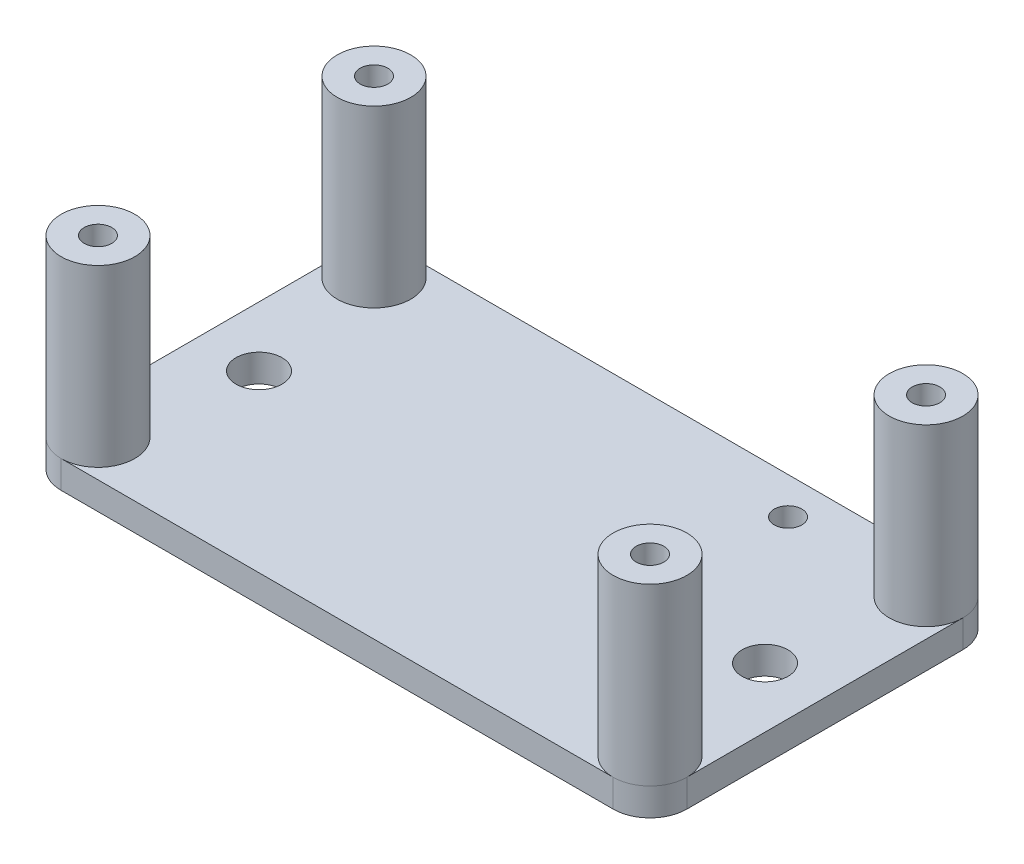
ISO-10303-21;
HEADER;
FILE_DESCRIPTION(('STEP AP214'),'2;1');
FILE_NAME('part.step','',(''),(''),'','','');
FILE_SCHEMA(('AUTOMOTIVE_DESIGN { 1 0 10303 214 1 1 1 1 }'));
ENDSEC;
DATA;
#1=APPLICATION_CONTEXT('core data for automotive mechanical design processes');
#2=APPLICATION_PROTOCOL_DEFINITION('international standard','automotive_design',2000,#1);
#3=PRODUCT_CONTEXT('',#1,'mechanical');
#4=PRODUCT('Part','Part','',(#3));
#5=PRODUCT_RELATED_PRODUCT_CATEGORY('part','',(#4));
#6=PRODUCT_DEFINITION_FORMATION('','',#4);
#7=PRODUCT_DEFINITION_CONTEXT('part definition',#1,'design');
#8=PRODUCT_DEFINITION('design','',#6,#7);
#9=PRODUCT_DEFINITION_SHAPE('','',#8);
#10=(LENGTH_UNIT() NAMED_UNIT(*) SI_UNIT(.MILLI.,.METRE.));
#11=(NAMED_UNIT(*) PLANE_ANGLE_UNIT() SI_UNIT($,.RADIAN.));
#12=(NAMED_UNIT(*) SI_UNIT($,.STERADIAN.) SOLID_ANGLE_UNIT());
#13=UNCERTAINTY_MEASURE_WITH_UNIT(LENGTH_MEASURE(1.E-05),#10,'distance_accuracy_value','');
#14=(GEOMETRIC_REPRESENTATION_CONTEXT(3) GLOBAL_UNCERTAINTY_ASSIGNED_CONTEXT((#13)) GLOBAL_UNIT_ASSIGNED_CONTEXT((#10,
#11,#12)) REPRESENTATION_CONTEXT('',''));
#15=CARTESIAN_POINT('',(0.,0.,0.));
#16=DIRECTION('',(0.,0.,1.));
#17=DIRECTION('',(1.,0.,0.));
#18=AXIS2_PLACEMENT_3D('',#15,#16,#17);
#19=CARTESIAN_POINT('',(0.,3.,0.));
#20=DIRECTION('',(0.,-1.,0.));
#21=DIRECTION('',(0.,0.,-1.));
#22=AXIS2_PLACEMENT_3D('',#19,#20,#21);
#23=PLANE('',#22);
#24=CARTESIAN_POINT('',(25.,3.,-14.1346153846153));
#25=DIRECTION('',(0.,1.,0.));
#26=DIRECTION('',(0.,0.,1.));
#27=AXIS2_PLACEMENT_3D('',#24,#25,#26);
#28=CIRCLE('',#27,1.5);
#29=CARTESIAN_POINT('',(25.,3.,-12.6346153846153));
#30=VERTEX_POINT('',#29);
#31=EDGE_CURVE('E191',#30,#30,#28,.T.);
#32=ORIENTED_EDGE('',*,*,#31,.F.);
#33=EDGE_LOOP('',(#32));
#34=FACE_BOUND('',#33,.T.);
#35=CARTESIAN_POINT('',(37.5,3.,0.865384615384675));
#36=DIRECTION('',(0.,1.,0.));
#37=DIRECTION('',(0.,0.,-1.));
#38=AXIS2_PLACEMENT_3D('',#35,#36,#37);
#39=CIRCLE('',#38,2.5);
#40=CARTESIAN_POINT('',(37.5,3.,-1.63461538461533));
#41=VERTEX_POINT('',#40);
#42=EDGE_CURVE('E185',#41,#41,#39,.T.);
#43=ORIENTED_EDGE('',*,*,#42,.F.);
#44=EDGE_LOOP('',(#43));
#45=FACE_BOUND('',#44,.T.);
#46=CARTESIAN_POINT('',(-17.5,3.,0.865384615384682));
#47=DIRECTION('',(0.,1.,0.));
#48=DIRECTION('',(0.,0.,1.));
#49=AXIS2_PLACEMENT_3D('',#46,#47,#48);
#50=CIRCLE('',#49,2.5);
#51=CARTESIAN_POINT('',(-17.5,3.,3.36538461538468));
#52=VERTEX_POINT('',#51);
#53=EDGE_CURVE('E181',#52,#52,#50,.T.);
#54=ORIENTED_EDGE('',*,*,#53,.F.);
#55=EDGE_LOOP('',(#54));
#56=FACE_BOUND('',#55,.T.);
#57=CARTESIAN_POINT('',(40.,3.,-14.1346153846153));
#58=DIRECTION('',(0.,1.,0.));
#59=DIRECTION('',(0.,0.,1.));
#60=AXIS2_PLACEMENT_3D('',#57,#58,#59);
#61=CIRCLE('',#60,4.);
#62=CARTESIAN_POINT('',(40.,3.,-18.1346153846153));
#63=VERTEX_POINT('',#62);
#64=CARTESIAN_POINT('',(44.,3.,-14.1346153846153));
#65=VERTEX_POINT('',#64);
#66=EDGE_CURVE('E120',#63,#65,#61,.T.);
#67=ORIENTED_EDGE('',*,*,#66,.F.);
#68=DIRECTION('',(-1.,0.,0.));
#69=VECTOR('',#68,1.);
#70=CARTESIAN_POINT('',(-24.,3.,-18.1346153846153));
#71=LINE('',#70,#69);
#72=CARTESIAN_POINT('',(-20.,3.,-18.1346153846153));
#73=VERTEX_POINT('',#72);
#74=EDGE_CURVE('E105',#63,#73,#71,.T.);
#75=ORIENTED_EDGE('',*,*,#74,.T.);
#76=CARTESIAN_POINT('',(-20.,3.,-14.1346153846153));
#77=DIRECTION('',(0.,1.,0.));
#78=DIRECTION('',(0.,0.,1.));
#79=AXIS2_PLACEMENT_3D('',#76,#77,#78);
#80=CIRCLE('',#79,4.);
#81=CARTESIAN_POINT('',(-24.,3.,-14.1346153846153));
#82=VERTEX_POINT('',#81);
#83=EDGE_CURVE('E222',#82,#73,#80,.T.);
#84=ORIENTED_EDGE('',*,*,#83,.F.);
#85=DIRECTION('',(0.,0.,1.));
#86=VECTOR('',#85,1.);
#87=CARTESIAN_POINT('',(-24.,3.,-18.1346153846153));
#88=LINE('',#87,#86);
#89=CARTESIAN_POINT('',(-24.,3.,15.8653846153847));
#90=VERTEX_POINT('',#89);
#91=EDGE_CURVE('E115',#82,#90,#88,.T.);
#92=ORIENTED_EDGE('',*,*,#91,.T.);
#93=CARTESIAN_POINT('',(-20.,3.,15.8653846153847));
#94=DIRECTION('',(0.,1.,0.));
#95=DIRECTION('',(0.,0.,1.));
#96=AXIS2_PLACEMENT_3D('',#93,#94,#95);
#97=CIRCLE('',#96,4.);
#98=CARTESIAN_POINT('',(-20.,3.,19.8653846153847));
#99=VERTEX_POINT('',#98);
#100=EDGE_CURVE('E200',#99,#90,#97,.T.);
#101=ORIENTED_EDGE('',*,*,#100,.F.);
#102=DIRECTION('',(1.,0.,0.));
#103=VECTOR('',#102,1.);
#104=CARTESIAN_POINT('',(-24.,3.,19.8653846153847));
#105=LINE('',#104,#103);
#106=CARTESIAN_POINT('',(40.,3.,19.8653846153847));
#107=VERTEX_POINT('',#106);
#108=EDGE_CURVE('E165',#99,#107,#105,.T.);
#109=ORIENTED_EDGE('',*,*,#108,.T.);
#110=CARTESIAN_POINT('',(40.,3.,15.8653846153847));
#111=DIRECTION('',(0.,1.,0.));
#112=DIRECTION('',(0.,0.,1.));
#113=AXIS2_PLACEMENT_3D('',#110,#111,#112);
#114=CIRCLE('',#113,4.00000000000001);
#115=CARTESIAN_POINT('',(44.,3.,15.8653846153847));
#116=VERTEX_POINT('',#115);
#117=EDGE_CURVE('E212',#116,#107,#114,.T.);
#118=ORIENTED_EDGE('',*,*,#117,.F.);
#119=DIRECTION('',(0.,0.,-1.));
#120=VECTOR('',#119,1.);
#121=CARTESIAN_POINT('',(44.,3.,-18.1346153846153));
#122=LINE('',#121,#120);
#123=EDGE_CURVE('E123',#116,#65,#122,.T.);
#124=ORIENTED_EDGE('',*,*,#123,.T.);
#125=EDGE_LOOP('',(#67,#75,#84,#92,#101,#109,#118,#124));
#126=FACE_BOUND('',#125,.T.);
#127=ADVANCED_FACE('F39',(#34,#45,#56,#126),#23,.F.);
#128=CARTESIAN_POINT('',(0.,0.,0.));
#129=DIRECTION('',(0.,-1.,0.));
#130=DIRECTION('',(0.,0.,-1.));
#131=AXIS2_PLACEMENT_3D('',#128,#129,#130);
#132=PLANE('',#131);
#133=CARTESIAN_POINT('',(37.5,0.,0.865384615384675));
#134=DIRECTION('',(0.,1.,0.));
#135=DIRECTION('',(0.,0.,-1.));
#136=AXIS2_PLACEMENT_3D('',#133,#134,#135);
#137=CIRCLE('',#136,2.5);
#138=CARTESIAN_POINT('',(37.5,0.,-1.63461538461533));
#139=VERTEX_POINT('',#138);
#140=EDGE_CURVE('E188',#139,#139,#137,.T.);
#141=ORIENTED_EDGE('',*,*,#140,.T.);
#142=EDGE_LOOP('',(#141));
#143=FACE_BOUND('',#142,.T.);
#144=CARTESIAN_POINT('',(40.,0.,15.8653846153847));
#145=DIRECTION('',(0.,1.,0.));
#146=DIRECTION('',(0.,0.,1.));
#147=AXIS2_PLACEMENT_3D('',#144,#145,#146);
#148=CIRCLE('',#147,1.5);
#149=CARTESIAN_POINT('',(40.,0.,17.3653846153847));
#150=VERTEX_POINT('',#149);
#151=EDGE_CURVE('E178',#150,#150,#148,.T.);
#152=ORIENTED_EDGE('',*,*,#151,.T.);
#153=EDGE_LOOP('',(#152));
#154=FACE_BOUND('',#153,.T.);
#155=CARTESIAN_POINT('',(-20.,0.,-14.1346153846153));
#156=DIRECTION('',(0.,1.,0.));
#157=DIRECTION('',(0.,0.,1.));
#158=AXIS2_PLACEMENT_3D('',#155,#156,#157);
#159=CIRCLE('',#158,1.5);
#160=CARTESIAN_POINT('',(-20.,0.,-12.6346153846153));
#161=VERTEX_POINT('',#160);
#162=EDGE_CURVE('E172',#161,#161,#159,.T.);
#163=ORIENTED_EDGE('',*,*,#162,.T.);
#164=EDGE_LOOP('',(#163));
#165=FACE_BOUND('',#164,.T.);
#166=DIRECTION('',(0.,0.,-1.));
#167=VECTOR('',#166,1.);
#168=CARTESIAN_POINT('',(44.,0.,-18.1346153846153));
#169=LINE('',#168,#167);
#170=CARTESIAN_POINT('',(44.,0.,15.8653846153847));
#171=VERTEX_POINT('',#170);
#172=CARTESIAN_POINT('',(44.,0.,-14.1346153846153));
#173=VERTEX_POINT('',#172);
#174=EDGE_CURVE('E116',#171,#173,#169,.T.);
#175=ORIENTED_EDGE('',*,*,#174,.F.);
#176=CARTESIAN_POINT('',(40.,0.,15.8653846153847));
#177=DIRECTION('',(0.,-1.,0.));
#178=DIRECTION('',(0.,0.,-1.));
#179=AXIS2_PLACEMENT_3D('',#176,#177,#178);
#180=CIRCLE('',#179,4.);
#181=CARTESIAN_POINT('',(40.,0.,19.8653846153847));
#182=VERTEX_POINT('',#181);
#183=EDGE_CURVE('E143',#171,#182,#180,.T.);
#184=ORIENTED_EDGE('',*,*,#183,.T.);
#185=DIRECTION('',(1.,0.,0.));
#186=VECTOR('',#185,1.);
#187=CARTESIAN_POINT('',(-24.,0.,19.8653846153847));
#188=LINE('',#187,#186);
#189=CARTESIAN_POINT('',(-20.,0.,19.8653846153847));
#190=VERTEX_POINT('',#189);
#191=EDGE_CURVE('E156',#190,#182,#188,.T.);
#192=ORIENTED_EDGE('',*,*,#191,.F.);
#193=CARTESIAN_POINT('',(-20.,0.,15.8653846153847));
#194=DIRECTION('',(0.,-1.,0.));
#195=DIRECTION('',(0.,0.,-1.));
#196=AXIS2_PLACEMENT_3D('',#193,#194,#195);
#197=CIRCLE('',#196,4.);
#198=CARTESIAN_POINT('',(-24.,0.,15.8653846153847));
#199=VERTEX_POINT('',#198);
#200=EDGE_CURVE('E54',#190,#199,#197,.T.);
#201=ORIENTED_EDGE('',*,*,#200,.T.);
#202=DIRECTION('',(0.,0.,1.));
#203=VECTOR('',#202,1.);
#204=CARTESIAN_POINT('',(-24.,0.,-18.1346153846153));
#205=LINE('',#204,#203);
#206=CARTESIAN_POINT('',(-24.,0.,-14.1346153846153));
#207=VERTEX_POINT('',#206);
#208=EDGE_CURVE('E159',#207,#199,#205,.T.);
#209=ORIENTED_EDGE('',*,*,#208,.F.);
#210=CARTESIAN_POINT('',(-20.,0.,-14.1346153846153));
#211=DIRECTION('',(0.,-1.,0.));
#212=DIRECTION('',(0.,0.,-1.));
#213=AXIS2_PLACEMENT_3D('',#210,#211,#212);
#214=CIRCLE('',#213,4.);
#215=CARTESIAN_POINT('',(-20.,0.,-18.1346153846153));
#216=VERTEX_POINT('',#215);
#217=EDGE_CURVE('E62',#207,#216,#214,.T.);
#218=ORIENTED_EDGE('',*,*,#217,.T.);
#219=DIRECTION('',(-1.,0.,0.));
#220=VECTOR('',#219,1.);
#221=CARTESIAN_POINT('',(-24.,0.,-18.1346153846153));
#222=LINE('',#221,#220);
#223=CARTESIAN_POINT('',(40.,0.,-18.1346153846153));
#224=VERTEX_POINT('',#223);
#225=EDGE_CURVE('E161',#224,#216,#222,.T.);
#226=ORIENTED_EDGE('',*,*,#225,.F.);
#227=CARTESIAN_POINT('',(40.,0.,-14.1346153846153));
#228=DIRECTION('',(0.,-1.,0.));
#229=DIRECTION('',(0.,0.,-1.));
#230=AXIS2_PLACEMENT_3D('',#227,#228,#229);
#231=CIRCLE('',#230,4.);
#232=EDGE_CURVE('E134',#224,#173,#231,.T.);
#233=ORIENTED_EDGE('',*,*,#232,.T.);
#234=EDGE_LOOP('',(#175,#184,#192,#201,#209,#218,#226,#233));
#235=FACE_BOUND('',#234,.T.);
#236=CARTESIAN_POINT('',(-20.,0.,15.8653846153847));
#237=DIRECTION('',(0.,1.,0.));
#238=DIRECTION('',(0.,0.,1.));
#239=AXIS2_PLACEMENT_3D('',#236,#237,#238);
#240=CIRCLE('',#239,1.5);
#241=CARTESIAN_POINT('',(-20.,0.,17.3653846153847));
#242=VERTEX_POINT('',#241);
#243=EDGE_CURVE('E163',#242,#242,#240,.T.);
#244=ORIENTED_EDGE('',*,*,#243,.T.);
#245=EDGE_LOOP('',(#244));
#246=FACE_BOUND('',#245,.T.);
#247=CARTESIAN_POINT('',(40.,0.,-14.1346153846153));
#248=DIRECTION('',(0.,1.,0.));
#249=DIRECTION('',(0.,0.,1.));
#250=AXIS2_PLACEMENT_3D('',#247,#248,#249);
#251=CIRCLE('',#250,1.5);
#252=CARTESIAN_POINT('',(40.,0.,-12.6346153846153));
#253=VERTEX_POINT('',#252);
#254=EDGE_CURVE('E175',#253,#253,#251,.T.);
#255=ORIENTED_EDGE('',*,*,#254,.T.);
#256=EDGE_LOOP('',(#255));
#257=FACE_BOUND('',#256,.T.);
#258=CARTESIAN_POINT('',(-17.5,0.,0.865384615384682));
#259=DIRECTION('',(0.,1.,0.));
#260=DIRECTION('',(0.,0.,1.));
#261=AXIS2_PLACEMENT_3D('',#258,#259,#260);
#262=CIRCLE('',#261,2.5);
#263=CARTESIAN_POINT('',(-17.5,0.,3.36538461538468));
#264=VERTEX_POINT('',#263);
#265=EDGE_CURVE('E182',#264,#264,#262,.T.);
#266=ORIENTED_EDGE('',*,*,#265,.T.);
#267=EDGE_LOOP('',(#266));
#268=FACE_BOUND('',#267,.T.);
#269=CARTESIAN_POINT('',(25.,0.,-14.1346153846153));
#270=DIRECTION('',(0.,1.,0.));
#271=DIRECTION('',(0.,0.,1.));
#272=AXIS2_PLACEMENT_3D('',#269,#270,#271);
#273=CIRCLE('',#272,1.5);
#274=CARTESIAN_POINT('',(25.,0.,-12.6346153846153));
#275=VERTEX_POINT('',#274);
#276=EDGE_CURVE('E194',#275,#275,#273,.T.);
#277=ORIENTED_EDGE('',*,*,#276,.T.);
#278=EDGE_LOOP('',(#277));
#279=FACE_BOUND('',#278,.T.);
#280=ADVANCED_FACE('F251',(#143,#154,#165,#235,#246,#257,#268,#279),#132,.T.);
#281=CARTESIAN_POINT('',(-24.,3.,-18.1346153846153));
#282=DIRECTION('',(0.,0.,1.));
#283=DIRECTION('',(1.,0.,0.));
#284=AXIS2_PLACEMENT_3D('',#281,#282,#283);
#285=PLANE('',#284);
#286=ORIENTED_EDGE('',*,*,#74,.F.);
#287=DIRECTION('',(0.,-1.,0.));
#288=VECTOR('',#287,1.);
#289=CARTESIAN_POINT('',(40.,3.,-18.1346153846153));
#290=LINE('',#289,#288);
#291=EDGE_CURVE('E110',#63,#224,#290,.T.);
#292=ORIENTED_EDGE('',*,*,#291,.T.);
#293=ORIENTED_EDGE('',*,*,#225,.T.);
#294=DIRECTION('',(0.,-1.,0.));
#295=VECTOR('',#294,1.);
#296=CARTESIAN_POINT('',(-20.,3.,-18.1346153846153));
#297=LINE('',#296,#295);
#298=EDGE_CURVE('E112',#216,#73,#297,.F.);
#299=ORIENTED_EDGE('',*,*,#298,.T.);
#300=EDGE_LOOP('',(#286,#292,#293,#299));
#301=FACE_BOUND('',#300,.T.);
#302=ADVANCED_FACE('F107',(#301),#285,.F.);
#303=CARTESIAN_POINT('',(-24.,3.,-18.1346153846153));
#304=DIRECTION('',(1.,0.,0.));
#305=DIRECTION('',(0.,0.,-1.));
#306=AXIS2_PLACEMENT_3D('',#303,#304,#305);
#307=PLANE('',#306);
#308=ORIENTED_EDGE('',*,*,#91,.F.);
#309=DIRECTION('',(0.,-1.,0.));
#310=VECTOR('',#309,1.);
#311=CARTESIAN_POINT('',(-24.,3.,-14.1346153846153));
#312=LINE('',#311,#310);
#313=EDGE_CURVE('E11',#82,#207,#312,.T.);
#314=ORIENTED_EDGE('',*,*,#313,.T.);
#315=ORIENTED_EDGE('',*,*,#208,.T.);
#316=DIRECTION('',(0.,-1.,0.));
#317=VECTOR('',#316,1.);
#318=CARTESIAN_POINT('',(-24.,3.,15.8653846153847));
#319=LINE('',#318,#317);
#320=EDGE_CURVE('E47',#199,#90,#319,.F.);
#321=ORIENTED_EDGE('',*,*,#320,.T.);
#322=EDGE_LOOP('',(#308,#314,#315,#321));
#323=FACE_BOUND('',#322,.T.);
#324=ADVANCED_FACE('F272',(#323),#307,.F.);
#325=CARTESIAN_POINT('',(-24.,3.,19.8653846153847));
#326=DIRECTION('',(0.,0.,-1.));
#327=DIRECTION('',(-1.,0.,0.));
#328=AXIS2_PLACEMENT_3D('',#325,#326,#327);
#329=PLANE('',#328);
#330=ORIENTED_EDGE('',*,*,#191,.T.);
#331=DIRECTION('',(0.,-1.,0.));
#332=VECTOR('',#331,1.);
#333=CARTESIAN_POINT('',(40.,3.,19.8653846153847));
#334=LINE('',#333,#332);
#335=EDGE_CURVE('E136',#182,#107,#334,.F.);
#336=ORIENTED_EDGE('',*,*,#335,.T.);
#337=ORIENTED_EDGE('',*,*,#108,.F.);
#338=DIRECTION('',(0.,-1.,0.));
#339=VECTOR('',#338,1.);
#340=CARTESIAN_POINT('',(-20.,3.,19.8653846153847));
#341=LINE('',#340,#339);
#342=EDGE_CURVE('E140',#99,#190,#341,.T.);
#343=ORIENTED_EDGE('',*,*,#342,.T.);
#344=EDGE_LOOP('',(#330,#336,#337,#343));
#345=FACE_BOUND('',#344,.T.);
#346=ADVANCED_FACE('F268',(#345),#329,.F.);
#347=CARTESIAN_POINT('',(44.,3.,-18.1346153846153));
#348=DIRECTION('',(-1.,0.,0.));
#349=DIRECTION('',(0.,0.,1.));
#350=AXIS2_PLACEMENT_3D('',#347,#348,#349);
#351=PLANE('',#350);
#352=ORIENTED_EDGE('',*,*,#123,.F.);
#353=DIRECTION('',(0.,-1.,0.));
#354=VECTOR('',#353,1.);
#355=CARTESIAN_POINT('',(44.,3.,15.8653846153847));
#356=LINE('',#355,#354);
#357=EDGE_CURVE('E148',#116,#171,#356,.T.);
#358=ORIENTED_EDGE('',*,*,#357,.T.);
#359=ORIENTED_EDGE('',*,*,#174,.T.);
#360=DIRECTION('',(0.,-1.,0.));
#361=VECTOR('',#360,1.);
#362=CARTESIAN_POINT('',(44.,3.,-14.1346153846153));
#363=LINE('',#362,#361);
#364=EDGE_CURVE('E151',#173,#65,#363,.F.);
#365=ORIENTED_EDGE('',*,*,#364,.T.);
#366=EDGE_LOOP('',(#352,#358,#359,#365));
#367=FACE_BOUND('',#366,.T.);
#368=ADVANCED_FACE('F265',(#367),#351,.F.);
#369=CARTESIAN_POINT('',(-20.,3.,15.8653846153847));
#370=DIRECTION('',(0.,-1.,0.));
#371=DIRECTION('',(0.,0.,-1.));
#372=AXIS2_PLACEMENT_3D('',#369,#370,#371);
#373=CYLINDRICAL_SURFACE('',#372,1.5);
#374=ORIENTED_EDGE('',*,*,#243,.F.);
#375=EDGE_LOOP('',(#374));
#376=FACE_BOUND('',#375,.T.);
#377=CARTESIAN_POINT('',(-20.,22.,15.8653846153847));
#378=DIRECTION('',(0.,1.,0.));
#379=DIRECTION('',(0.,0.,1.));
#380=AXIS2_PLACEMENT_3D('',#377,#378,#379);
#381=CIRCLE('',#380,1.5);
#382=CARTESIAN_POINT('',(-20.,22.,17.3653846153847));
#383=VERTEX_POINT('',#382);
#384=EDGE_CURVE('E203',#383,#383,#381,.T.);
#385=ORIENTED_EDGE('',*,*,#384,.T.);
#386=EDGE_LOOP('',(#385));
#387=FACE_BOUND('',#386,.T.);
#388=ADVANCED_FACE('F262',(#376,#387),#373,.F.);
#389=CARTESIAN_POINT('',(-20.,3.,-14.1346153846153));
#390=DIRECTION('',(0.,-1.,0.));
#391=DIRECTION('',(0.,0.,-1.));
#392=AXIS2_PLACEMENT_3D('',#389,#390,#391);
#393=CYLINDRICAL_SURFACE('',#392,1.5);
#394=ORIENTED_EDGE('',*,*,#162,.F.);
#395=EDGE_LOOP('',(#394));
#396=FACE_BOUND('',#395,.T.);
#397=CARTESIAN_POINT('',(-20.,22.,-14.1346153846153));
#398=DIRECTION('',(0.,1.,0.));
#399=DIRECTION('',(0.,0.,1.));
#400=AXIS2_PLACEMENT_3D('',#397,#398,#399);
#401=CIRCLE('',#400,1.5);
#402=CARTESIAN_POINT('',(-20.,22.,-12.6346153846153));
#403=VERTEX_POINT('',#402);
#404=EDGE_CURVE('E225',#403,#403,#401,.T.);
#405=ORIENTED_EDGE('',*,*,#404,.T.);
#406=EDGE_LOOP('',(#405));
#407=FACE_BOUND('',#406,.T.);
#408=ADVANCED_FACE('F340',(#396,#407),#393,.F.);
#409=CARTESIAN_POINT('',(40.,3.,-14.1346153846153));
#410=DIRECTION('',(0.,-1.,0.));
#411=DIRECTION('',(0.,0.,-1.));
#412=AXIS2_PLACEMENT_3D('',#409,#410,#411);
#413=CYLINDRICAL_SURFACE('',#412,1.5);
#414=ORIENTED_EDGE('',*,*,#254,.F.);
#415=EDGE_LOOP('',(#414));
#416=FACE_BOUND('',#415,.T.);
#417=CARTESIAN_POINT('',(40.,22.,-14.1346153846153));
#418=DIRECTION('',(0.,1.,0.));
#419=DIRECTION('',(0.,0.,1.));
#420=AXIS2_PLACEMENT_3D('',#417,#418,#419);
#421=CIRCLE('',#420,1.5);
#422=CARTESIAN_POINT('',(40.,22.,-12.6346153846153));
#423=VERTEX_POINT('',#422);
#424=EDGE_CURVE('E127',#423,#423,#421,.T.);
#425=ORIENTED_EDGE('',*,*,#424,.T.);
#426=EDGE_LOOP('',(#425));
#427=FACE_BOUND('',#426,.T.);
#428=ADVANCED_FACE('F233',(#416,#427),#413,.F.);
#429=CARTESIAN_POINT('',(40.,3.,15.8653846153847));
#430=DIRECTION('',(0.,-1.,0.));
#431=DIRECTION('',(0.,0.,-1.));
#432=AXIS2_PLACEMENT_3D('',#429,#430,#431);
#433=CYLINDRICAL_SURFACE('',#432,1.5);
#434=ORIENTED_EDGE('',*,*,#151,.F.);
#435=EDGE_LOOP('',(#434));
#436=FACE_BOUND('',#435,.T.);
#437=CARTESIAN_POINT('',(40.,22.,15.8653846153847));
#438=DIRECTION('',(0.,1.,0.));
#439=DIRECTION('',(0.,0.,1.));
#440=AXIS2_PLACEMENT_3D('',#437,#438,#439);
#441=CIRCLE('',#440,1.5);
#442=CARTESIAN_POINT('',(40.,22.,17.3653846153847));
#443=VERTEX_POINT('',#442);
#444=EDGE_CURVE('E215',#443,#443,#441,.T.);
#445=ORIENTED_EDGE('',*,*,#444,.T.);
#446=EDGE_LOOP('',(#445));
#447=FACE_BOUND('',#446,.T.);
#448=ADVANCED_FACE('F334',(#436,#447),#433,.F.);
#449=CARTESIAN_POINT('',(-17.5,3.,0.865384615384682));
#450=DIRECTION('',(0.,-1.,0.));
#451=DIRECTION('',(0.,0.,-1.));
#452=AXIS2_PLACEMENT_3D('',#449,#450,#451);
#453=CYLINDRICAL_SURFACE('',#452,2.5);
#454=ORIENTED_EDGE('',*,*,#53,.T.);
#455=EDGE_LOOP('',(#454));
#456=FACE_BOUND('',#455,.T.);
#457=ORIENTED_EDGE('',*,*,#265,.F.);
#458=EDGE_LOOP('',(#457));
#459=FACE_BOUND('',#458,.T.);
#460=ADVANCED_FACE('F327',(#456,#459),#453,.F.);
#461=CARTESIAN_POINT('',(37.5,3.,0.865384615384675));
#462=DIRECTION('',(0.,-1.,0.));
#463=DIRECTION('',(0.,0.,-1.));
#464=AXIS2_PLACEMENT_3D('',#461,#462,#463);
#465=CYLINDRICAL_SURFACE('',#464,2.5);
#466=ORIENTED_EDGE('',*,*,#42,.T.);
#467=EDGE_LOOP('',(#466));
#468=FACE_BOUND('',#467,.T.);
#469=ORIENTED_EDGE('',*,*,#140,.F.);
#470=EDGE_LOOP('',(#469));
#471=FACE_BOUND('',#470,.T.);
#472=ADVANCED_FACE('F318',(#468,#471),#465,.F.);
#473=CARTESIAN_POINT('',(25.,3.,-14.1346153846153));
#474=DIRECTION('',(0.,-1.,0.));
#475=DIRECTION('',(0.,0.,-1.));
#476=AXIS2_PLACEMENT_3D('',#473,#474,#475);
#477=CYLINDRICAL_SURFACE('',#476,1.5);
#478=ORIENTED_EDGE('',*,*,#31,.T.);
#479=EDGE_LOOP('',(#478));
#480=FACE_BOUND('',#479,.T.);
#481=ORIENTED_EDGE('',*,*,#276,.F.);
#482=EDGE_LOOP('',(#481));
#483=FACE_BOUND('',#482,.T.);
#484=ADVANCED_FACE('F315',(#480,#483),#477,.F.);
#485=CARTESIAN_POINT('',(-20.,22.,15.8653846153847));
#486=DIRECTION('',(0.,1.,0.));
#487=DIRECTION('',(0.,0.,1.));
#488=AXIS2_PLACEMENT_3D('',#485,#486,#487);
#489=PLANE('',#488);
#490=CARTESIAN_POINT('',(-20.,22.,15.8653846153847));
#491=DIRECTION('',(0.,1.,0.));
#492=DIRECTION('',(0.,0.,1.));
#493=AXIS2_PLACEMENT_3D('',#490,#491,#492);
#494=CIRCLE('',#493,4.);
#495=CARTESIAN_POINT('',(-20.,22.,19.8653846153847));
#496=VERTEX_POINT('',#495);
#497=EDGE_CURVE('E197',#496,#496,#494,.T.);
#498=ORIENTED_EDGE('',*,*,#497,.T.);
#499=EDGE_LOOP('',(#498));
#500=FACE_BOUND('',#499,.T.);
#501=ORIENTED_EDGE('',*,*,#384,.F.);
#502=EDGE_LOOP('',(#501));
#503=FACE_BOUND('',#502,.T.);
#504=ADVANCED_FACE('F317',(#500,#503),#489,.T.);
#505=CARTESIAN_POINT('',(-20.,22.,15.8653846153847));
#506=DIRECTION('',(0.,-1.,0.));
#507=DIRECTION('',(0.,0.,-1.));
#508=AXIS2_PLACEMENT_3D('',#505,#506,#507);
#509=CYLINDRICAL_SURFACE('',#508,4.);
#510=ORIENTED_EDGE('',*,*,#497,.F.);
#511=EDGE_LOOP('',(#510));
#512=FACE_BOUND('',#511,.T.);
#513=ORIENTED_EDGE('',*,*,#100,.T.);
#514=EDGE_CURVE('E153',#90,#99,#97,.T.);
#515=ORIENTED_EDGE('',*,*,#514,.T.);
#516=EDGE_LOOP('',(#513,#515));
#517=FACE_BOUND('',#516,.T.);
#518=ADVANCED_FACE('F298',(#512,#517),#509,.T.);
#519=CARTESIAN_POINT('',(40.,22.,15.8653846153847));
#520=DIRECTION('',(0.,1.,0.));
#521=DIRECTION('',(0.,0.,1.));
#522=AXIS2_PLACEMENT_3D('',#519,#520,#521);
#523=PLANE('',#522);
#524=CARTESIAN_POINT('',(40.,22.,15.8653846153847));
#525=DIRECTION('',(0.,1.,0.));
#526=DIRECTION('',(0.,0.,1.));
#527=AXIS2_PLACEMENT_3D('',#524,#525,#526);
#528=CIRCLE('',#527,4.00000000000001);
#529=CARTESIAN_POINT('',(40.,22.,19.8653846153847));
#530=VERTEX_POINT('',#529);
#531=EDGE_CURVE('E208',#530,#530,#528,.T.);
#532=ORIENTED_EDGE('',*,*,#531,.T.);
#533=EDGE_LOOP('',(#532));
#534=FACE_BOUND('',#533,.T.);
#535=ORIENTED_EDGE('',*,*,#444,.F.);
#536=EDGE_LOOP('',(#535));
#537=FACE_BOUND('',#536,.T.);
#538=ADVANCED_FACE('F358',(#534,#537),#523,.T.);
#539=CARTESIAN_POINT('',(40.,22.,15.8653846153847));
#540=DIRECTION('',(0.,-1.,0.));
#541=DIRECTION('',(0.,0.,-1.));
#542=AXIS2_PLACEMENT_3D('',#539,#540,#541);
#543=CYLINDRICAL_SURFACE('',#542,4.00000000000001);
#544=ORIENTED_EDGE('',*,*,#531,.F.);
#545=EDGE_LOOP('',(#544));
#546=FACE_BOUND('',#545,.T.);
#547=EDGE_CURVE('E209',#107,#116,#114,.T.);
#548=ORIENTED_EDGE('',*,*,#547,.T.);
#549=ORIENTED_EDGE('',*,*,#117,.T.);
#550=EDGE_LOOP('',(#548,#549));
#551=FACE_BOUND('',#550,.T.);
#552=ADVANCED_FACE('F302',(#546,#551),#543,.T.);
#553=CARTESIAN_POINT('',(-20.,22.,-14.1346153846153));
#554=DIRECTION('',(0.,1.,0.));
#555=DIRECTION('',(0.,0.,1.));
#556=AXIS2_PLACEMENT_3D('',#553,#554,#555);
#557=PLANE('',#556);
#558=CARTESIAN_POINT('',(-20.,22.,-14.1346153846153));
#559=DIRECTION('',(0.,1.,0.));
#560=DIRECTION('',(0.,0.,1.));
#561=AXIS2_PLACEMENT_3D('',#558,#559,#560);
#562=CIRCLE('',#561,4.);
#563=CARTESIAN_POINT('',(-20.,22.,-10.1346153846153));
#564=VERTEX_POINT('',#563);
#565=EDGE_CURVE('E218',#564,#564,#562,.T.);
#566=ORIENTED_EDGE('',*,*,#565,.T.);
#567=EDGE_LOOP('',(#566));
#568=FACE_BOUND('',#567,.T.);
#569=ORIENTED_EDGE('',*,*,#404,.F.);
#570=EDGE_LOOP('',(#569));
#571=FACE_BOUND('',#570,.T.);
#572=ADVANCED_FACE('F247',(#568,#571),#557,.T.);
#573=CARTESIAN_POINT('',(-20.,22.,-14.1346153846153));
#574=DIRECTION('',(0.,-1.,0.));
#575=DIRECTION('',(0.,0.,-1.));
#576=AXIS2_PLACEMENT_3D('',#573,#574,#575);
#577=CYLINDRICAL_SURFACE('',#576,4.);
#578=ORIENTED_EDGE('',*,*,#565,.F.);
#579=EDGE_LOOP('',(#578));
#580=FACE_BOUND('',#579,.T.);
#581=EDGE_CURVE('E219',#73,#82,#80,.T.);
#582=ORIENTED_EDGE('',*,*,#581,.T.);
#583=ORIENTED_EDGE('',*,*,#83,.T.);
#584=EDGE_LOOP('',(#582,#583));
#585=FACE_BOUND('',#584,.T.);
#586=ADVANCED_FACE('F237',(#580,#585),#577,.T.);
#587=CARTESIAN_POINT('',(40.,22.,-14.1346153846153));
#588=DIRECTION('',(0.,1.,0.));
#589=DIRECTION('',(0.,0.,1.));
#590=AXIS2_PLACEMENT_3D('',#587,#588,#589);
#591=PLANE('',#590);
#592=CARTESIAN_POINT('',(40.,22.,-14.1346153846153));
#593=DIRECTION('',(0.,1.,0.));
#594=DIRECTION('',(0.,0.,1.));
#595=AXIS2_PLACEMENT_3D('',#592,#593,#594);
#596=CIRCLE('',#595,4.);
#597=CARTESIAN_POINT('',(40.,22.,-10.1346153846153));
#598=VERTEX_POINT('',#597);
#599=EDGE_CURVE('E132',#598,#598,#596,.T.);
#600=ORIENTED_EDGE('',*,*,#599,.T.);
#601=EDGE_LOOP('',(#600));
#602=FACE_BOUND('',#601,.T.);
#603=ORIENTED_EDGE('',*,*,#424,.F.);
#604=EDGE_LOOP('',(#603));
#605=FACE_BOUND('',#604,.T.);
#606=ADVANCED_FACE('F235',(#602,#605),#591,.T.);
#607=CARTESIAN_POINT('',(40.,22.,-14.1346153846153));
#608=DIRECTION('',(0.,-1.,0.));
#609=DIRECTION('',(0.,0.,-1.));
#610=AXIS2_PLACEMENT_3D('',#607,#608,#609);
#611=CYLINDRICAL_SURFACE('',#610,4.);
#612=ORIENTED_EDGE('',*,*,#599,.F.);
#613=EDGE_LOOP('',(#612));
#614=FACE_BOUND('',#613,.T.);
#615=EDGE_CURVE('E126',#65,#63,#61,.T.);
#616=ORIENTED_EDGE('',*,*,#615,.T.);
#617=ORIENTED_EDGE('',*,*,#66,.T.);
#618=EDGE_LOOP('',(#616,#617));
#619=FACE_BOUND('',#618,.T.);
#620=ADVANCED_FACE('F129',(#614,#619),#611,.T.);
#621=CARTESIAN_POINT('',(40.,3.,15.8653846153847));
#622=DIRECTION('',(0.,-1.,0.));
#623=DIRECTION('',(0.,0.,-1.));
#624=AXIS2_PLACEMENT_3D('',#621,#622,#623);
#625=CYLINDRICAL_SURFACE('',#624,4.);
#626=ORIENTED_EDGE('',*,*,#547,.F.);
#627=ORIENTED_EDGE('',*,*,#335,.F.);
#628=ORIENTED_EDGE('',*,*,#183,.F.);
#629=ORIENTED_EDGE('',*,*,#357,.F.);
#630=EDGE_LOOP('',(#626,#627,#628,#629));
#631=FACE_BOUND('',#630,.T.);
#632=ADVANCED_FACE('F244',(#631),#625,.T.);
#633=CARTESIAN_POINT('',(40.,3.,-14.1346153846153));
#634=DIRECTION('',(0.,-1.,0.));
#635=DIRECTION('',(0.,0.,-1.));
#636=AXIS2_PLACEMENT_3D('',#633,#634,#635);
#637=CYLINDRICAL_SURFACE('',#636,4.);
#638=ORIENTED_EDGE('',*,*,#615,.F.);
#639=ORIENTED_EDGE('',*,*,#364,.F.);
#640=ORIENTED_EDGE('',*,*,#232,.F.);
#641=ORIENTED_EDGE('',*,*,#291,.F.);
#642=EDGE_LOOP('',(#638,#639,#640,#641));
#643=FACE_BOUND('',#642,.T.);
#644=ADVANCED_FACE('F133',(#643),#637,.T.);
#645=CARTESIAN_POINT('',(-20.,3.,-14.1346153846153));
#646=DIRECTION('',(0.,-1.,0.));
#647=DIRECTION('',(0.,0.,-1.));
#648=AXIS2_PLACEMENT_3D('',#645,#646,#647);
#649=CYLINDRICAL_SURFACE('',#648,4.);
#650=ORIENTED_EDGE('',*,*,#581,.F.);
#651=ORIENTED_EDGE('',*,*,#298,.F.);
#652=ORIENTED_EDGE('',*,*,#217,.F.);
#653=ORIENTED_EDGE('',*,*,#313,.F.);
#654=EDGE_LOOP('',(#650,#651,#652,#653));
#655=FACE_BOUND('',#654,.T.);
#656=ADVANCED_FACE('F283',(#655),#649,.T.);
#657=CARTESIAN_POINT('',(-20.,3.,15.8653846153847));
#658=DIRECTION('',(0.,-1.,0.));
#659=DIRECTION('',(0.,0.,-1.));
#660=AXIS2_PLACEMENT_3D('',#657,#658,#659);
#661=CYLINDRICAL_SURFACE('',#660,4.);
#662=ORIENTED_EDGE('',*,*,#514,.F.);
#663=ORIENTED_EDGE('',*,*,#320,.F.);
#664=ORIENTED_EDGE('',*,*,#200,.F.);
#665=ORIENTED_EDGE('',*,*,#342,.F.);
#666=EDGE_LOOP('',(#662,#663,#664,#665));
#667=FACE_BOUND('',#666,.T.);
#668=ADVANCED_FACE('F41',(#667),#661,.T.);
#669=CLOSED_SHELL('',(#127,#280,#302,#324,#346,#368,#388,#408,#428,#448,#460,#472,#484,#504,
#518,#538,#552,#572,#586,#606,#620,#632,#644,#656,#668));
#670=MANIFOLD_SOLID_BREP('B2',#669);
#671=ADVANCED_BREP_SHAPE_REPRESENTATION('',(#18,#670),#14);
#672=SHAPE_DEFINITION_REPRESENTATION(#9,#671);
ENDSEC;
END-ISO-10303-21;
